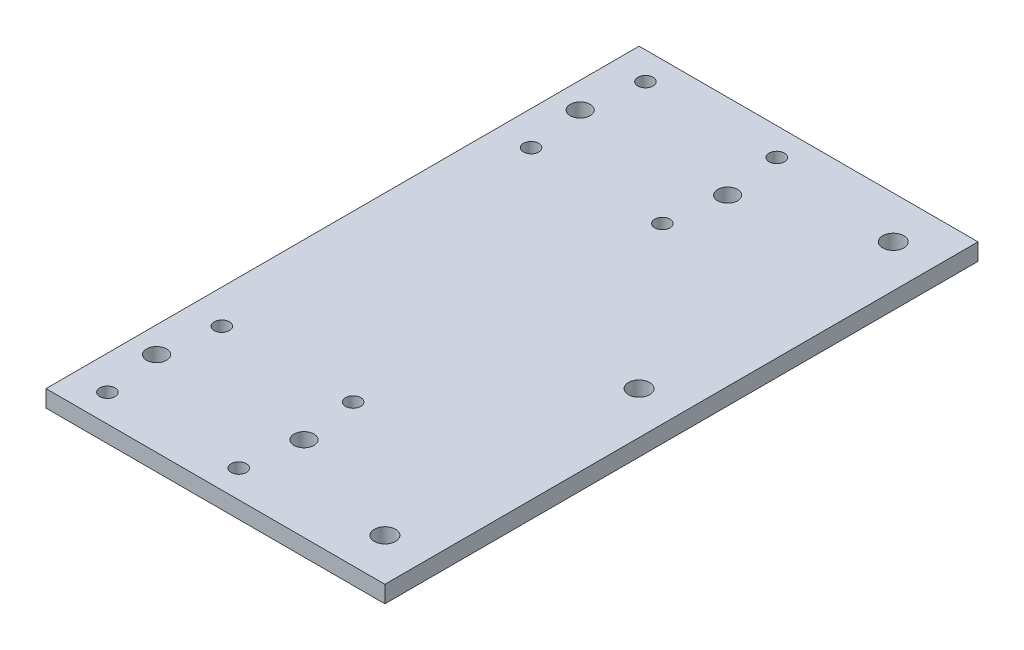
ISO-10303-21;
HEADER;
FILE_DESCRIPTION(('STEP AP214'),'2;1');
FILE_NAME('part.step','',(''),(''),'','','');
FILE_SCHEMA(('AUTOMOTIVE_DESIGN { 1 0 10303 214 1 1 1 1 }'));
ENDSEC;
DATA;
#1=APPLICATION_CONTEXT('core data for automotive mechanical design processes');
#2=APPLICATION_PROTOCOL_DEFINITION('international standard','automotive_design',2000,#1);
#3=PRODUCT_CONTEXT('',#1,'mechanical');
#4=PRODUCT('Part','Part','',(#3));
#5=PRODUCT_RELATED_PRODUCT_CATEGORY('part','',(#4));
#6=PRODUCT_DEFINITION_FORMATION('','',#4);
#7=PRODUCT_DEFINITION_CONTEXT('part definition',#1,'design');
#8=PRODUCT_DEFINITION('design','',#6,#7);
#9=PRODUCT_DEFINITION_SHAPE('','',#8);
#10=(LENGTH_UNIT() NAMED_UNIT(*) SI_UNIT(.MILLI.,.METRE.));
#11=(NAMED_UNIT(*) PLANE_ANGLE_UNIT() SI_UNIT($,.RADIAN.));
#12=(NAMED_UNIT(*) SI_UNIT($,.STERADIAN.) SOLID_ANGLE_UNIT());
#13=UNCERTAINTY_MEASURE_WITH_UNIT(LENGTH_MEASURE(1.E-05),#10,'distance_accuracy_value','');
#14=(GEOMETRIC_REPRESENTATION_CONTEXT(3) GLOBAL_UNCERTAINTY_ASSIGNED_CONTEXT((#13)) GLOBAL_UNIT_ASSIGNED_CONTEXT((#10,
#11,#12)) REPRESENTATION_CONTEXT('',''));
#15=CARTESIAN_POINT('',(0.,0.,0.));
#16=DIRECTION('',(0.,0.,1.));
#17=DIRECTION('',(1.,0.,0.));
#18=AXIS2_PLACEMENT_3D('',#15,#16,#17);
#19=CARTESIAN_POINT('',(0.,4.,0.));
#20=DIRECTION('',(0.,1.,0.));
#21=DIRECTION('',(0.,0.,1.));
#22=AXIS2_PLACEMENT_3D('',#19,#20,#21);
#23=PLANE('',#22);
#24=CARTESIAN_POINT('',(-72.,4.,36.5));
#25=DIRECTION('',(0.,1.,0.));
#26=DIRECTION('',(0.,0.,1.));
#27=AXIS2_PLACEMENT_3D('',#24,#25,#26);
#28=CIRCLE('',#27,1.79999999999999);
#29=CARTESIAN_POINT('',(-72.,4.,38.3));
#30=VERTEX_POINT('',#29);
#31=EDGE_CURVE('E229',#30,#30,#28,.T.);
#32=ORIENTED_EDGE('',*,*,#31,.F.);
#33=EDGE_LOOP('',(#32));
#34=FACE_BOUND('',#33,.T.);
#35=CARTESIAN_POINT('',(-41.,4.,-63.5));
#36=DIRECTION('',(0.,1.,0.));
#37=DIRECTION('',(0.,0.,1.));
#38=AXIS2_PLACEMENT_3D('',#35,#36,#37);
#39=CIRCLE('',#38,1.79999999999999);
#40=CARTESIAN_POINT('',(-41.,4.,-61.7));
#41=VERTEX_POINT('',#40);
#42=EDGE_CURVE('E275',#41,#41,#39,.F.);
#43=ORIENTED_EDGE('',*,*,#42,.T.);
#44=EDGE_LOOP('',(#43));
#45=FACE_BOUND('',#44,.T.);
#46=CARTESIAN_POINT('',(-72.,4.,-36.5));
#47=DIRECTION('',(0.,1.,0.));
#48=DIRECTION('',(0.,0.,1.));
#49=AXIS2_PLACEMENT_3D('',#46,#47,#48);
#50=CIRCLE('',#49,1.79999999999999);
#51=CARTESIAN_POINT('',(-72.,4.,-34.7));
#52=VERTEX_POINT('',#51);
#53=EDGE_CURVE('E315',#52,#52,#50,.F.);
#54=ORIENTED_EDGE('',*,*,#53,.T.);
#55=EDGE_LOOP('',(#54));
#56=FACE_BOUND('',#55,.T.);
#57=CARTESIAN_POINT('',(-73.9,4.,-50.));
#58=DIRECTION('',(0.,1.,0.));
#59=DIRECTION('',(0.,0.,1.));
#60=AXIS2_PLACEMENT_3D('',#57,#58,#59);
#61=CIRCLE('',#60,2.35);
#62=CARTESIAN_POINT('',(-73.9,4.,-47.65));
#63=VERTEX_POINT('',#62);
#64=EDGE_CURVE('E307',#63,#63,#61,.T.);
#65=ORIENTED_EDGE('',*,*,#64,.F.);
#66=EDGE_LOOP('',(#65));
#67=FACE_BOUND('',#66,.T.);
#68=CARTESIAN_POINT('',(-41.,4.,36.5));
#69=DIRECTION('',(0.,1.,0.));
#70=DIRECTION('',(0.,0.,1.));
#71=AXIS2_PLACEMENT_3D('',#68,#69,#70);
#72=CIRCLE('',#71,1.79999999999999);
#73=CARTESIAN_POINT('',(-41.,4.,38.3));
#74=VERTEX_POINT('',#73);
#75=EDGE_CURVE('E250',#74,#74,#72,.F.);
#76=ORIENTED_EDGE('',*,*,#75,.T.);
#77=EDGE_LOOP('',(#76));
#78=FACE_BOUND('',#77,.T.);
#79=CARTESIAN_POINT('',(-9.99999999999879,4.,60.));
#80=DIRECTION('',(0.,1.,0.));
#81=DIRECTION('',(0.,0.,1.));
#82=AXIS2_PLACEMENT_3D('',#79,#80,#81);
#83=CIRCLE('',#82,2.5);
#84=CARTESIAN_POINT('',(-9.99999999999879,4.,62.5));
#85=VERTEX_POINT('',#84);
#86=EDGE_CURVE('E258',#85,#85,#83,.T.);
#87=ORIENTED_EDGE('',*,*,#86,.F.);
#88=EDGE_LOOP('',(#87));
#89=FACE_BOUND('',#88,.T.);
#90=CARTESIAN_POINT('',(-9.99999999999941,4.,0.));
#91=DIRECTION('',(0.,1.,0.));
#92=DIRECTION('',(0.,0.,1.));
#93=AXIS2_PLACEMENT_3D('',#90,#91,#92);
#94=CIRCLE('',#93,2.5);
#95=CARTESIAN_POINT('',(-9.99999999999941,4.,2.50000000000002));
#96=VERTEX_POINT('',#95);
#97=EDGE_CURVE('E266',#96,#96,#94,.T.);
#98=ORIENTED_EDGE('',*,*,#97,.F.);
#99=EDGE_LOOP('',(#98));
#100=FACE_BOUND('',#99,.T.);
#101=CARTESIAN_POINT('',(-72.,4.,-63.5));
#102=DIRECTION('',(0.,1.,0.));
#103=DIRECTION('',(0.,0.,1.));
#104=AXIS2_PLACEMENT_3D('',#101,#102,#103);
#105=CIRCLE('',#104,1.79999999999999);
#106=CARTESIAN_POINT('',(-72.,4.,-61.7));
#107=VERTEX_POINT('',#106);
#108=EDGE_CURVE('E306',#107,#107,#105,.T.);
#109=ORIENTED_EDGE('',*,*,#108,.F.);
#110=EDGE_LOOP('',(#109));
#111=FACE_BOUND('',#110,.T.);
#112=DIRECTION('',(1.,0.,0.));
#113=VECTOR('',#112,1.);
#114=CARTESIAN_POINT('',(0.,4.,-70.));
#115=LINE('',#114,#113);
#116=CARTESIAN_POINT('',(-80.,4.,-70.));
#117=VERTEX_POINT('',#116);
#118=CARTESIAN_POINT('',(0.,4.,-70.));
#119=VERTEX_POINT('',#118);
#120=EDGE_CURVE('E109',#117,#119,#115,.T.);
#121=ORIENTED_EDGE('',*,*,#120,.F.);
#122=DIRECTION('',(0.,0.,-1.));
#123=VECTOR('',#122,1.);
#124=CARTESIAN_POINT('',(-80.,4.,0.));
#125=LINE('',#124,#123);
#126=CARTESIAN_POINT('',(-80.,4.,70.));
#127=VERTEX_POINT('',#126);
#128=EDGE_CURVE('E95',#127,#117,#125,.T.);
#129=ORIENTED_EDGE('',*,*,#128,.F.);
#130=DIRECTION('',(1.,0.,0.));
#131=VECTOR('',#130,1.);
#132=CARTESIAN_POINT('',(0.,4.,70.));
#133=LINE('',#132,#131);
#134=CARTESIAN_POINT('',(0.,4.,70.));
#135=VERTEX_POINT('',#134);
#136=EDGE_CURVE('E101',#127,#135,#133,.T.);
#137=ORIENTED_EDGE('',*,*,#136,.T.);
#138=DIRECTION('',(0.,0.,1.));
#139=VECTOR('',#138,1.);
#140=CARTESIAN_POINT('',(0.,4.,0.));
#141=LINE('',#140,#139);
#142=EDGE_CURVE('E106',#119,#135,#141,.T.);
#143=ORIENTED_EDGE('',*,*,#142,.F.);
#144=EDGE_LOOP('',(#121,#129,#137,#143));
#145=FACE_BOUND('',#144,.T.);
#146=CARTESIAN_POINT('',(-39.1,4.,50.));
#147=DIRECTION('',(0.,1.,0.));
#148=DIRECTION('',(0.,0.,1.));
#149=AXIS2_PLACEMENT_3D('',#146,#147,#148);
#150=CIRCLE('',#149,2.35);
#151=CARTESIAN_POINT('',(-39.1,4.,52.35));
#152=VERTEX_POINT('',#151);
#153=EDGE_CURVE('E242',#152,#152,#150,.T.);
#154=ORIENTED_EDGE('',*,*,#153,.F.);
#155=EDGE_LOOP('',(#154));
#156=FACE_BOUND('',#155,.T.);
#157=CARTESIAN_POINT('',(-41.,4.,63.5));
#158=DIRECTION('',(0.,1.,0.));
#159=DIRECTION('',(0.,0.,1.));
#160=AXIS2_PLACEMENT_3D('',#157,#158,#159);
#161=CIRCLE('',#160,1.79999999999999);
#162=CARTESIAN_POINT('',(-41.,4.,65.3));
#163=VERTEX_POINT('',#162);
#164=EDGE_CURVE('E232',#163,#163,#161,.T.);
#165=ORIENTED_EDGE('',*,*,#164,.F.);
#166=EDGE_LOOP('',(#165));
#167=FACE_BOUND('',#166,.T.);
#168=CARTESIAN_POINT('',(-72.,4.,63.5));
#169=DIRECTION('',(0.,1.,0.));
#170=DIRECTION('',(0.,0.,1.));
#171=AXIS2_PLACEMENT_3D('',#168,#169,#170);
#172=CIRCLE('',#171,1.79999999999999);
#173=CARTESIAN_POINT('',(-72.,4.,65.3));
#174=VERTEX_POINT('',#173);
#175=EDGE_CURVE('E222',#174,#174,#172,.F.);
#176=ORIENTED_EDGE('',*,*,#175,.T.);
#177=EDGE_LOOP('',(#176));
#178=FACE_BOUND('',#177,.T.);
#179=CARTESIAN_POINT('',(-41.,4.,-36.5));
#180=DIRECTION('',(0.,1.,0.));
#181=DIRECTION('',(0.,0.,1.));
#182=AXIS2_PLACEMENT_3D('',#179,#180,#181);
#183=CIRCLE('',#182,1.79999999999999);
#184=CARTESIAN_POINT('',(-41.,4.,-34.7));
#185=VERTEX_POINT('',#184);
#186=EDGE_CURVE('E323',#185,#185,#183,.T.);
#187=ORIENTED_EDGE('',*,*,#186,.F.);
#188=EDGE_LOOP('',(#187));
#189=FACE_BOUND('',#188,.T.);
#190=CARTESIAN_POINT('',(-39.1,4.,-50.));
#191=DIRECTION('',(0.,1.,0.));
#192=DIRECTION('',(0.,0.,1.));
#193=AXIS2_PLACEMENT_3D('',#190,#191,#192);
#194=CIRCLE('',#193,2.35);
#195=CARTESIAN_POINT('',(-39.1,4.,-47.65));
#196=VERTEX_POINT('',#195);
#197=EDGE_CURVE('E274',#196,#196,#194,.F.);
#198=ORIENTED_EDGE('',*,*,#197,.T.);
#199=EDGE_LOOP('',(#198));
#200=FACE_BOUND('',#199,.T.);
#201=CARTESIAN_POINT('',(-10.,4.,-60.));
#202=DIRECTION('',(0.,1.,0.));
#203=DIRECTION('',(0.,0.,1.));
#204=AXIS2_PLACEMENT_3D('',#201,#202,#203);
#205=CIRCLE('',#204,2.5);
#206=CARTESIAN_POINT('',(-10.,4.,-57.5));
#207=VERTEX_POINT('',#206);
#208=EDGE_CURVE('E283',#207,#207,#205,.T.);
#209=ORIENTED_EDGE('',*,*,#208,.F.);
#210=EDGE_LOOP('',(#209));
#211=FACE_BOUND('',#210,.T.);
#212=CARTESIAN_POINT('',(-73.9,4.,50.));
#213=DIRECTION('',(0.,1.,0.));
#214=DIRECTION('',(0.,0.,1.));
#215=AXIS2_PLACEMENT_3D('',#212,#213,#214);
#216=CIRCLE('',#215,2.35);
#217=CARTESIAN_POINT('',(-73.9,4.,52.35));
#218=VERTEX_POINT('',#217);
#219=EDGE_CURVE('E291',#218,#218,#216,.F.);
#220=ORIENTED_EDGE('',*,*,#219,.T.);
#221=EDGE_LOOP('',(#220));
#222=FACE_BOUND('',#221,.T.);
#223=ADVANCED_FACE('F47',(#34,#45,#56,#67,#78,#89,#100,#111,#145,#156,#167,#178,#189,#200,#211,
#222),#23,.T.);
#224=CARTESIAN_POINT('',(0.,0.,0.));
#225=DIRECTION('',(0.,1.,0.));
#226=DIRECTION('',(0.,0.,1.));
#227=AXIS2_PLACEMENT_3D('',#224,#225,#226);
#228=PLANE('',#227);
#229=CARTESIAN_POINT('',(-72.,0.,36.5));
#230=DIRECTION('',(0.,1.,0.));
#231=DIRECTION('',(0.,0.,1.));
#232=AXIS2_PLACEMENT_3D('',#229,#230,#231);
#233=CIRCLE('',#232,1.79999999999999);
#234=CARTESIAN_POINT('',(-72.,0.,38.3));
#235=VERTEX_POINT('',#234);
#236=EDGE_CURVE('E295',#235,#235,#233,.T.);
#237=ORIENTED_EDGE('',*,*,#236,.T.);
#238=EDGE_LOOP('',(#237));
#239=FACE_BOUND('',#238,.T.);
#240=CARTESIAN_POINT('',(-10.,0.,-60.));
#241=DIRECTION('',(0.,1.,0.));
#242=DIRECTION('',(0.,0.,1.));
#243=AXIS2_PLACEMENT_3D('',#240,#241,#242);
#244=CIRCLE('',#243,2.5);
#245=CARTESIAN_POINT('',(-10.,0.,-57.5));
#246=VERTEX_POINT('',#245);
#247=EDGE_CURVE('E279',#246,#246,#244,.T.);
#248=ORIENTED_EDGE('',*,*,#247,.T.);
#249=EDGE_LOOP('',(#248));
#250=FACE_BOUND('',#249,.T.);
#251=CARTESIAN_POINT('',(-41.,0.,-36.5));
#252=DIRECTION('',(0.,1.,0.));
#253=DIRECTION('',(0.,0.,1.));
#254=AXIS2_PLACEMENT_3D('',#251,#252,#253);
#255=CIRCLE('',#254,1.79999999999999);
#256=CARTESIAN_POINT('',(-41.,0.,-34.7));
#257=VERTEX_POINT('',#256);
#258=EDGE_CURVE('E319',#257,#257,#255,.T.);
#259=ORIENTED_EDGE('',*,*,#258,.T.);
#260=EDGE_LOOP('',(#259));
#261=FACE_BOUND('',#260,.T.);
#262=CARTESIAN_POINT('',(-73.9,0.,-50.));
#263=DIRECTION('',(0.,1.,0.));
#264=DIRECTION('',(0.,0.,1.));
#265=AXIS2_PLACEMENT_3D('',#262,#263,#264);
#266=CIRCLE('',#265,2.35);
#267=CARTESIAN_POINT('',(-73.9,0.,-47.65));
#268=VERTEX_POINT('',#267);
#269=EDGE_CURVE('E302',#268,#268,#266,.T.);
#270=ORIENTED_EDGE('',*,*,#269,.T.);
#271=EDGE_LOOP('',(#270));
#272=FACE_BOUND('',#271,.T.);
#273=CARTESIAN_POINT('',(-41.,0.,63.5));
#274=DIRECTION('',(0.,1.,0.));
#275=DIRECTION('',(0.,0.,1.));
#276=AXIS2_PLACEMENT_3D('',#273,#274,#275);
#277=CIRCLE('',#276,1.79999999999999);
#278=CARTESIAN_POINT('',(-41.,0.,65.3));
#279=VERTEX_POINT('',#278);
#280=EDGE_CURVE('E225',#279,#279,#277,.T.);
#281=ORIENTED_EDGE('',*,*,#280,.T.);
#282=EDGE_LOOP('',(#281));
#283=FACE_BOUND('',#282,.T.);
#284=CARTESIAN_POINT('',(-39.1,0.,50.));
#285=DIRECTION('',(0.,1.,0.));
#286=DIRECTION('',(0.,0.,1.));
#287=AXIS2_PLACEMENT_3D('',#284,#285,#286);
#288=CIRCLE('',#287,2.35);
#289=CARTESIAN_POINT('',(-39.1,0.,52.35));
#290=VERTEX_POINT('',#289);
#291=EDGE_CURVE('E238',#290,#290,#288,.T.);
#292=ORIENTED_EDGE('',*,*,#291,.T.);
#293=EDGE_LOOP('',(#292));
#294=FACE_BOUND('',#293,.T.);
#295=CARTESIAN_POINT('',(-9.99999999999879,0.,60.));
#296=DIRECTION('',(0.,1.,0.));
#297=DIRECTION('',(0.,0.,1.));
#298=AXIS2_PLACEMENT_3D('',#295,#296,#297);
#299=CIRCLE('',#298,2.5);
#300=CARTESIAN_POINT('',(-9.99999999999879,0.,62.5));
#301=VERTEX_POINT('',#300);
#302=EDGE_CURVE('E254',#301,#301,#299,.T.);
#303=ORIENTED_EDGE('',*,*,#302,.T.);
#304=EDGE_LOOP('',(#303));
#305=FACE_BOUND('',#304,.T.);
#306=CARTESIAN_POINT('',(-9.99999999999941,0.,0.));
#307=DIRECTION('',(0.,1.,0.));
#308=DIRECTION('',(0.,0.,1.));
#309=AXIS2_PLACEMENT_3D('',#306,#307,#308);
#310=CIRCLE('',#309,2.5);
#311=CARTESIAN_POINT('',(-9.99999999999941,0.,2.50000000000002));
#312=VERTEX_POINT('',#311);
#313=EDGE_CURVE('E262',#312,#312,#310,.T.);
#314=ORIENTED_EDGE('',*,*,#313,.T.);
#315=EDGE_LOOP('',(#314));
#316=FACE_BOUND('',#315,.T.);
#317=CARTESIAN_POINT('',(-72.,0.,-63.5));
#318=DIRECTION('',(0.,1.,0.));
#319=DIRECTION('',(0.,0.,1.));
#320=AXIS2_PLACEMENT_3D('',#317,#318,#319);
#321=CIRCLE('',#320,1.79999999999999);
#322=CARTESIAN_POINT('',(-72.,0.,-61.7));
#323=VERTEX_POINT('',#322);
#324=EDGE_CURVE('E122',#323,#323,#321,.T.);
#325=ORIENTED_EDGE('',*,*,#324,.T.);
#326=EDGE_LOOP('',(#325));
#327=FACE_BOUND('',#326,.T.);
#328=DIRECTION('',(1.,0.,0.));
#329=VECTOR('',#328,1.);
#330=CARTESIAN_POINT('',(0.,0.,-70.));
#331=LINE('',#330,#329);
#332=CARTESIAN_POINT('',(-80.,0.,-70.));
#333=VERTEX_POINT('',#332);
#334=CARTESIAN_POINT('',(0.,0.,-70.));
#335=VERTEX_POINT('',#334);
#336=EDGE_CURVE('E119',#333,#335,#331,.T.);
#337=ORIENTED_EDGE('',*,*,#336,.T.);
#338=DIRECTION('',(0.,0.,1.));
#339=VECTOR('',#338,1.);
#340=CARTESIAN_POINT('',(0.,0.,0.));
#341=LINE('',#340,#339);
#342=CARTESIAN_POINT('',(0.,0.,70.));
#343=VERTEX_POINT('',#342);
#344=EDGE_CURVE('E113',#335,#343,#341,.T.);
#345=ORIENTED_EDGE('',*,*,#344,.T.);
#346=DIRECTION('',(1.,0.,0.));
#347=VECTOR('',#346,1.);
#348=CARTESIAN_POINT('',(0.,0.,70.));
#349=LINE('',#348,#347);
#350=CARTESIAN_POINT('',(-80.,0.,70.));
#351=VERTEX_POINT('',#350);
#352=EDGE_CURVE('E125',#351,#343,#349,.T.);
#353=ORIENTED_EDGE('',*,*,#352,.F.);
#354=DIRECTION('',(0.,0.,-1.));
#355=VECTOR('',#354,1.);
#356=CARTESIAN_POINT('',(-80.,0.,0.));
#357=LINE('',#356,#355);
#358=EDGE_CURVE('E97',#351,#333,#357,.T.);
#359=ORIENTED_EDGE('',*,*,#358,.T.);
#360=EDGE_LOOP('',(#337,#345,#353,#359));
#361=FACE_BOUND('',#360,.T.);
#362=CARTESIAN_POINT('',(-41.,0.,36.5));
#363=DIRECTION('',(0.,1.,0.));
#364=DIRECTION('',(0.,0.,1.));
#365=AXIS2_PLACEMENT_3D('',#362,#363,#364);
#366=CIRCLE('',#365,1.79999999999999);
#367=CARTESIAN_POINT('',(-41.,0.,38.3));
#368=VERTEX_POINT('',#367);
#369=EDGE_CURVE('E246',#368,#368,#366,.F.);
#370=ORIENTED_EDGE('',*,*,#369,.F.);
#371=EDGE_LOOP('',(#370));
#372=FACE_BOUND('',#371,.T.);
#373=CARTESIAN_POINT('',(-72.,0.,63.5));
#374=DIRECTION('',(0.,1.,0.));
#375=DIRECTION('',(0.,0.,1.));
#376=AXIS2_PLACEMENT_3D('',#373,#374,#375);
#377=CIRCLE('',#376,1.79999999999999);
#378=CARTESIAN_POINT('',(-72.,0.,65.3));
#379=VERTEX_POINT('',#378);
#380=EDGE_CURVE('E219',#379,#379,#377,.F.);
#381=ORIENTED_EDGE('',*,*,#380,.F.);
#382=EDGE_LOOP('',(#381));
#383=FACE_BOUND('',#382,.T.);
#384=CARTESIAN_POINT('',(-72.,0.,-36.5));
#385=DIRECTION('',(0.,1.,0.));
#386=DIRECTION('',(0.,0.,1.));
#387=AXIS2_PLACEMENT_3D('',#384,#385,#386);
#388=CIRCLE('',#387,1.79999999999999);
#389=CARTESIAN_POINT('',(-72.,0.,-34.7));
#390=VERTEX_POINT('',#389);
#391=EDGE_CURVE('E311',#390,#390,#388,.F.);
#392=ORIENTED_EDGE('',*,*,#391,.F.);
#393=EDGE_LOOP('',(#392));
#394=FACE_BOUND('',#393,.T.);
#395=CARTESIAN_POINT('',(-39.1,0.,-50.));
#396=DIRECTION('',(0.,1.,0.));
#397=DIRECTION('',(0.,0.,1.));
#398=AXIS2_PLACEMENT_3D('',#395,#396,#397);
#399=CIRCLE('',#398,2.35);
#400=CARTESIAN_POINT('',(-39.1,0.,-47.65));
#401=VERTEX_POINT('',#400);
#402=EDGE_CURVE('E327',#401,#401,#399,.F.);
#403=ORIENTED_EDGE('',*,*,#402,.F.);
#404=EDGE_LOOP('',(#403));
#405=FACE_BOUND('',#404,.T.);
#406=CARTESIAN_POINT('',(-41.,0.,-63.5));
#407=DIRECTION('',(0.,1.,0.));
#408=DIRECTION('',(0.,0.,1.));
#409=AXIS2_PLACEMENT_3D('',#406,#407,#408);
#410=CIRCLE('',#409,1.79999999999999);
#411=CARTESIAN_POINT('',(-41.,0.,-61.7));
#412=VERTEX_POINT('',#411);
#413=EDGE_CURVE('E270',#412,#412,#410,.F.);
#414=ORIENTED_EDGE('',*,*,#413,.F.);
#415=EDGE_LOOP('',(#414));
#416=FACE_BOUND('',#415,.T.);
#417=CARTESIAN_POINT('',(-73.9,0.,50.));
#418=DIRECTION('',(0.,1.,0.));
#419=DIRECTION('',(0.,0.,1.));
#420=AXIS2_PLACEMENT_3D('',#417,#418,#419);
#421=CIRCLE('',#420,2.35);
#422=CARTESIAN_POINT('',(-73.9,0.,52.35));
#423=VERTEX_POINT('',#422);
#424=EDGE_CURVE('E287',#423,#423,#421,.F.);
#425=ORIENTED_EDGE('',*,*,#424,.F.);
#426=EDGE_LOOP('',(#425));
#427=FACE_BOUND('',#426,.T.);
#428=ADVANCED_FACE('F135',(#239,#250,#261,#272,#283,#294,#305,#316,#327,#361,#372,#383,#394,
#405,#416,#427),#228,.F.);
#429=CARTESIAN_POINT('',(0.,4.,-70.));
#430=DIRECTION('',(0.,0.,-1.));
#431=DIRECTION('',(-1.,0.,0.));
#432=AXIS2_PLACEMENT_3D('',#429,#430,#431);
#433=PLANE('',#432);
#434=ORIENTED_EDGE('',*,*,#336,.F.);
#435=DIRECTION('',(0.,-1.,0.));
#436=VECTOR('',#435,1.);
#437=CARTESIAN_POINT('',(-80.,4.,-70.));
#438=LINE('',#437,#436);
#439=EDGE_CURVE('E11',#117,#333,#438,.T.);
#440=ORIENTED_EDGE('',*,*,#439,.F.);
#441=ORIENTED_EDGE('',*,*,#120,.T.);
#442=DIRECTION('',(0.,-1.,0.));
#443=VECTOR('',#442,1.);
#444=CARTESIAN_POINT('',(0.,4.,-70.));
#445=LINE('',#444,#443);
#446=EDGE_CURVE('E65',#119,#335,#445,.T.);
#447=ORIENTED_EDGE('',*,*,#446,.T.);
#448=EDGE_LOOP('',(#434,#440,#441,#447));
#449=FACE_BOUND('',#448,.T.);
#450=ADVANCED_FACE('F49',(#449),#433,.T.);
#451=CARTESIAN_POINT('',(-80.,4.,0.));
#452=DIRECTION('',(-1.,0.,0.));
#453=DIRECTION('',(0.,0.,1.));
#454=AXIS2_PLACEMENT_3D('',#451,#452,#453);
#455=PLANE('',#454);
#456=ORIENTED_EDGE('',*,*,#358,.F.);
#457=DIRECTION('',(0.,-1.,0.));
#458=VECTOR('',#457,1.);
#459=CARTESIAN_POINT('',(-80.,4.,70.));
#460=LINE('',#459,#458);
#461=EDGE_CURVE('E57',#127,#351,#460,.T.);
#462=ORIENTED_EDGE('',*,*,#461,.F.);
#463=ORIENTED_EDGE('',*,*,#128,.T.);
#464=ORIENTED_EDGE('',*,*,#439,.T.);
#465=EDGE_LOOP('',(#456,#462,#463,#464));
#466=FACE_BOUND('',#465,.T.);
#467=ADVANCED_FACE('F93',(#466),#455,.T.);
#468=CARTESIAN_POINT('',(0.,4.,70.));
#469=DIRECTION('',(0.,0.,-1.));
#470=DIRECTION('',(-1.,0.,0.));
#471=AXIS2_PLACEMENT_3D('',#468,#469,#470);
#472=PLANE('',#471);
#473=ORIENTED_EDGE('',*,*,#352,.T.);
#474=DIRECTION('',(0.,-1.,0.));
#475=VECTOR('',#474,1.);
#476=CARTESIAN_POINT('',(0.,4.,70.));
#477=LINE('',#476,#475);
#478=EDGE_CURVE('E79',#135,#343,#477,.T.);
#479=ORIENTED_EDGE('',*,*,#478,.F.);
#480=ORIENTED_EDGE('',*,*,#136,.F.);
#481=ORIENTED_EDGE('',*,*,#461,.T.);
#482=EDGE_LOOP('',(#473,#479,#480,#481));
#483=FACE_BOUND('',#482,.T.);
#484=ADVANCED_FACE('F102',(#483),#472,.F.);
#485=CARTESIAN_POINT('',(0.,4.,0.));
#486=DIRECTION('',(1.,0.,0.));
#487=DIRECTION('',(0.,0.,-1.));
#488=AXIS2_PLACEMENT_3D('',#485,#486,#487);
#489=PLANE('',#488);
#490=ORIENTED_EDGE('',*,*,#344,.F.);
#491=ORIENTED_EDGE('',*,*,#446,.F.);
#492=ORIENTED_EDGE('',*,*,#142,.T.);
#493=ORIENTED_EDGE('',*,*,#478,.T.);
#494=EDGE_LOOP('',(#490,#491,#492,#493));
#495=FACE_BOUND('',#494,.T.);
#496=ADVANCED_FACE('F137',(#495),#489,.T.);
#497=CARTESIAN_POINT('',(-72.,0.,-63.5));
#498=DIRECTION('',(0.,1.,0.));
#499=DIRECTION('',(0.,0.,1.));
#500=AXIS2_PLACEMENT_3D('',#497,#498,#499);
#501=CYLINDRICAL_SURFACE('',#500,1.79999999999999);
#502=ORIENTED_EDGE('',*,*,#324,.F.);
#503=EDGE_LOOP('',(#502));
#504=FACE_BOUND('',#503,.T.);
#505=ORIENTED_EDGE('',*,*,#108,.T.);
#506=EDGE_LOOP('',(#505));
#507=FACE_BOUND('',#506,.T.);
#508=ADVANCED_FACE('F139',(#504,#507),#501,.F.);
#509=CARTESIAN_POINT('',(-9.99999999999941,0.,0.));
#510=DIRECTION('',(0.,1.,0.));
#511=DIRECTION('',(0.,0.,1.));
#512=AXIS2_PLACEMENT_3D('',#509,#510,#511);
#513=CYLINDRICAL_SURFACE('',#512,2.5);
#514=ORIENTED_EDGE('',*,*,#313,.F.);
#515=EDGE_LOOP('',(#514));
#516=FACE_BOUND('',#515,.T.);
#517=ORIENTED_EDGE('',*,*,#97,.T.);
#518=EDGE_LOOP('',(#517));
#519=FACE_BOUND('',#518,.T.);
#520=ADVANCED_FACE('F146',(#516,#519),#513,.F.);
#521=CARTESIAN_POINT('',(-9.99999999999879,0.,60.));
#522=DIRECTION('',(0.,1.,0.));
#523=DIRECTION('',(0.,0.,1.));
#524=AXIS2_PLACEMENT_3D('',#521,#522,#523);
#525=CYLINDRICAL_SURFACE('',#524,2.5);
#526=ORIENTED_EDGE('',*,*,#302,.F.);
#527=EDGE_LOOP('',(#526));
#528=FACE_BOUND('',#527,.T.);
#529=ORIENTED_EDGE('',*,*,#86,.T.);
#530=EDGE_LOOP('',(#529));
#531=FACE_BOUND('',#530,.T.);
#532=ADVANCED_FACE('F195',(#528,#531),#525,.F.);
#533=CARTESIAN_POINT('',(-41.,0.,36.5));
#534=DIRECTION('',(0.,1.,0.));
#535=DIRECTION('',(0.,0.,1.));
#536=AXIS2_PLACEMENT_3D('',#533,#534,#535);
#537=CYLINDRICAL_SURFACE('',#536,1.79999999999999);
#538=ORIENTED_EDGE('',*,*,#369,.T.);
#539=EDGE_LOOP('',(#538));
#540=FACE_BOUND('',#539,.T.);
#541=ORIENTED_EDGE('',*,*,#75,.F.);
#542=EDGE_LOOP('',(#541));
#543=FACE_BOUND('',#542,.T.);
#544=ADVANCED_FACE('F199',(#540,#543),#537,.F.);
#545=CARTESIAN_POINT('',(-39.1,0.,50.));
#546=DIRECTION('',(0.,1.,0.));
#547=DIRECTION('',(0.,0.,1.));
#548=AXIS2_PLACEMENT_3D('',#545,#546,#547);
#549=CYLINDRICAL_SURFACE('',#548,2.35);
#550=ORIENTED_EDGE('',*,*,#291,.F.);
#551=EDGE_LOOP('',(#550));
#552=FACE_BOUND('',#551,.T.);
#553=ORIENTED_EDGE('',*,*,#153,.T.);
#554=EDGE_LOOP('',(#553));
#555=FACE_BOUND('',#554,.T.);
#556=ADVANCED_FACE('F203',(#552,#555),#549,.F.);
#557=CARTESIAN_POINT('',(-41.,0.,63.5));
#558=DIRECTION('',(0.,1.,0.));
#559=DIRECTION('',(0.,0.,1.));
#560=AXIS2_PLACEMENT_3D('',#557,#558,#559);
#561=CYLINDRICAL_SURFACE('',#560,1.79999999999999);
#562=ORIENTED_EDGE('',*,*,#280,.F.);
#563=EDGE_LOOP('',(#562));
#564=FACE_BOUND('',#563,.T.);
#565=ORIENTED_EDGE('',*,*,#164,.T.);
#566=EDGE_LOOP('',(#565));
#567=FACE_BOUND('',#566,.T.);
#568=ADVANCED_FACE('F207',(#564,#567),#561,.F.);
#569=CARTESIAN_POINT('',(-72.,0.,63.5));
#570=DIRECTION('',(0.,1.,0.));
#571=DIRECTION('',(0.,0.,1.));
#572=AXIS2_PLACEMENT_3D('',#569,#570,#571);
#573=CYLINDRICAL_SURFACE('',#572,1.79999999999999);
#574=ORIENTED_EDGE('',*,*,#380,.T.);
#575=EDGE_LOOP('',(#574));
#576=FACE_BOUND('',#575,.T.);
#577=ORIENTED_EDGE('',*,*,#175,.F.);
#578=EDGE_LOOP('',(#577));
#579=FACE_BOUND('',#578,.T.);
#580=ADVANCED_FACE('F176',(#576,#579),#573,.F.);
#581=CARTESIAN_POINT('',(-73.9,0.,-50.));
#582=DIRECTION('',(0.,1.,0.));
#583=DIRECTION('',(0.,0.,1.));
#584=AXIS2_PLACEMENT_3D('',#581,#582,#583);
#585=CYLINDRICAL_SURFACE('',#584,2.35);
#586=ORIENTED_EDGE('',*,*,#269,.F.);
#587=EDGE_LOOP('',(#586));
#588=FACE_BOUND('',#587,.T.);
#589=ORIENTED_EDGE('',*,*,#64,.T.);
#590=EDGE_LOOP('',(#589));
#591=FACE_BOUND('',#590,.T.);
#592=ADVANCED_FACE('F172',(#588,#591),#585,.F.);
#593=CARTESIAN_POINT('',(-72.,0.,-36.5));
#594=DIRECTION('',(0.,1.,0.));
#595=DIRECTION('',(0.,0.,1.));
#596=AXIS2_PLACEMENT_3D('',#593,#594,#595);
#597=CYLINDRICAL_SURFACE('',#596,1.79999999999999);
#598=ORIENTED_EDGE('',*,*,#391,.T.);
#599=EDGE_LOOP('',(#598));
#600=FACE_BOUND('',#599,.T.);
#601=ORIENTED_EDGE('',*,*,#53,.F.);
#602=EDGE_LOOP('',(#601));
#603=FACE_BOUND('',#602,.T.);
#604=ADVANCED_FACE('F168',(#600,#603),#597,.F.);
#605=CARTESIAN_POINT('',(-41.,0.,-36.5));
#606=DIRECTION('',(0.,1.,0.));
#607=DIRECTION('',(0.,0.,1.));
#608=AXIS2_PLACEMENT_3D('',#605,#606,#607);
#609=CYLINDRICAL_SURFACE('',#608,1.79999999999999);
#610=ORIENTED_EDGE('',*,*,#258,.F.);
#611=EDGE_LOOP('',(#610));
#612=FACE_BOUND('',#611,.T.);
#613=ORIENTED_EDGE('',*,*,#186,.T.);
#614=EDGE_LOOP('',(#613));
#615=FACE_BOUND('',#614,.T.);
#616=ADVANCED_FACE('F164',(#612,#615),#609,.F.);
#617=CARTESIAN_POINT('',(-39.1,0.,-50.));
#618=DIRECTION('',(0.,1.,0.));
#619=DIRECTION('',(0.,0.,1.));
#620=AXIS2_PLACEMENT_3D('',#617,#618,#619);
#621=CYLINDRICAL_SURFACE('',#620,2.35);
#622=ORIENTED_EDGE('',*,*,#402,.T.);
#623=EDGE_LOOP('',(#622));
#624=FACE_BOUND('',#623,.T.);
#625=ORIENTED_EDGE('',*,*,#197,.F.);
#626=EDGE_LOOP('',(#625));
#627=FACE_BOUND('',#626,.T.);
#628=ADVANCED_FACE('F160',(#624,#627),#621,.F.);
#629=CARTESIAN_POINT('',(-41.,0.,-63.5));
#630=DIRECTION('',(0.,1.,0.));
#631=DIRECTION('',(0.,0.,1.));
#632=AXIS2_PLACEMENT_3D('',#629,#630,#631);
#633=CYLINDRICAL_SURFACE('',#632,1.79999999999999);
#634=ORIENTED_EDGE('',*,*,#413,.T.);
#635=EDGE_LOOP('',(#634));
#636=FACE_BOUND('',#635,.T.);
#637=ORIENTED_EDGE('',*,*,#42,.F.);
#638=EDGE_LOOP('',(#637));
#639=FACE_BOUND('',#638,.T.);
#640=ADVANCED_FACE('F163',(#636,#639),#633,.F.);
#641=CARTESIAN_POINT('',(-10.,0.,-60.));
#642=DIRECTION('',(0.,1.,0.));
#643=DIRECTION('',(0.,0.,1.));
#644=AXIS2_PLACEMENT_3D('',#641,#642,#643);
#645=CYLINDRICAL_SURFACE('',#644,2.5);
#646=ORIENTED_EDGE('',*,*,#247,.F.);
#647=EDGE_LOOP('',(#646));
#648=FACE_BOUND('',#647,.T.);
#649=ORIENTED_EDGE('',*,*,#208,.T.);
#650=EDGE_LOOP('',(#649));
#651=FACE_BOUND('',#650,.T.);
#652=ADVANCED_FACE('F185',(#648,#651),#645,.F.);
#653=CARTESIAN_POINT('',(-73.9,0.,50.));
#654=DIRECTION('',(0.,1.,0.));
#655=DIRECTION('',(0.,0.,1.));
#656=AXIS2_PLACEMENT_3D('',#653,#654,#655);
#657=CYLINDRICAL_SURFACE('',#656,2.35);
#658=ORIENTED_EDGE('',*,*,#424,.T.);
#659=EDGE_LOOP('',(#658));
#660=FACE_BOUND('',#659,.T.);
#661=ORIENTED_EDGE('',*,*,#219,.F.);
#662=EDGE_LOOP('',(#661));
#663=FACE_BOUND('',#662,.T.);
#664=ADVANCED_FACE('F181',(#660,#663),#657,.F.);
#665=CARTESIAN_POINT('',(-72.,0.,36.5));
#666=DIRECTION('',(0.,1.,0.));
#667=DIRECTION('',(0.,0.,1.));
#668=AXIS2_PLACEMENT_3D('',#665,#666,#667);
#669=CYLINDRICAL_SURFACE('',#668,1.79999999999999);
#670=ORIENTED_EDGE('',*,*,#236,.F.);
#671=EDGE_LOOP('',(#670));
#672=FACE_BOUND('',#671,.T.);
#673=ORIENTED_EDGE('',*,*,#31,.T.);
#674=EDGE_LOOP('',(#673));
#675=FACE_BOUND('',#674,.T.);
#676=ADVANCED_FACE('F178',(#672,#675),#669,.F.);
#677=CLOSED_SHELL('',(#223,#428,#450,#467,#484,#496,#508,#520,#532,#544,#556,#568,#580,#592,
#604,#616,#628,#640,#652,#664,#676));
#678=MANIFOLD_SOLID_BREP('B2',#677);
#679=ADVANCED_BREP_SHAPE_REPRESENTATION('',(#18,#678),#14);
#680=SHAPE_DEFINITION_REPRESENTATION(#9,#679);
ENDSEC;
END-ISO-10303-21;
